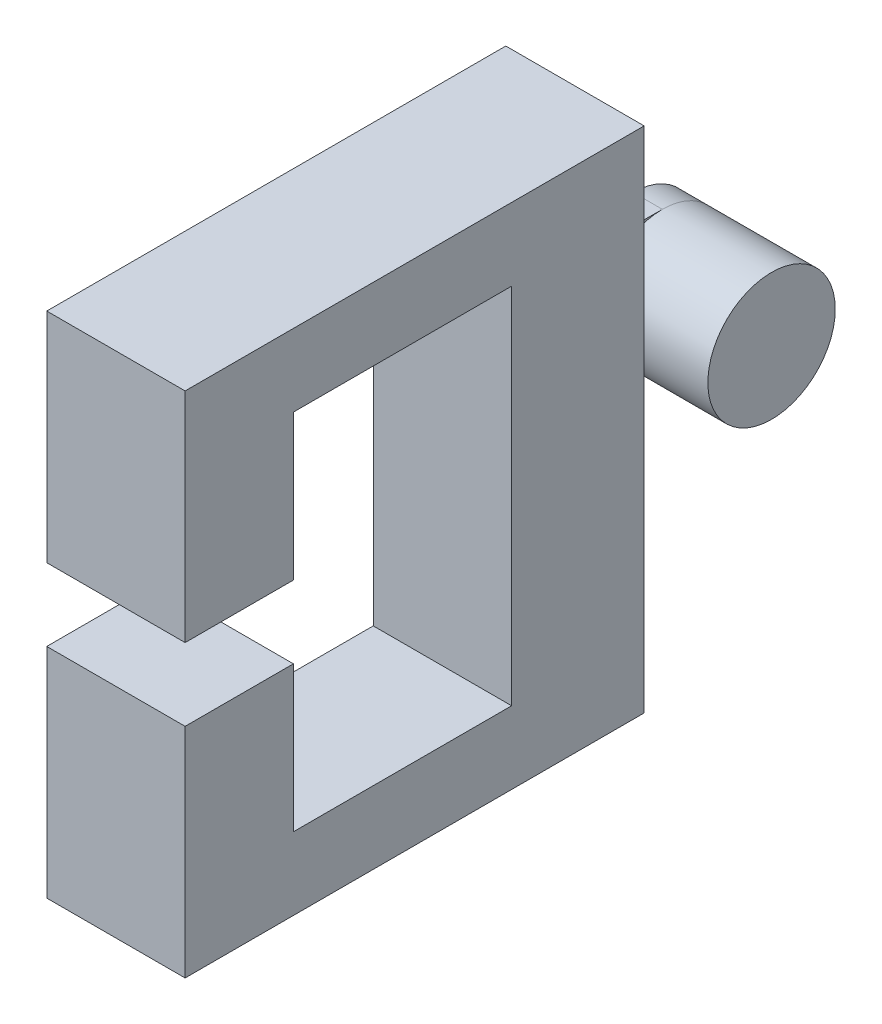
ISO-10303-21;
HEADER;
FILE_DESCRIPTION(('STEP AP214'),'2;1');
FILE_NAME('part.step','',(''),(''),'','','');
FILE_SCHEMA(('AUTOMOTIVE_DESIGN { 1 0 10303 214 1 1 1 1 }'));
ENDSEC;
DATA;
#1=APPLICATION_CONTEXT('core data for automotive mechanical design processes');
#2=APPLICATION_PROTOCOL_DEFINITION('international standard','automotive_design',2000,#1);
#3=PRODUCT_CONTEXT('',#1,'mechanical');
#4=PRODUCT('Part','Part','',(#3));
#5=PRODUCT_RELATED_PRODUCT_CATEGORY('part','',(#4));
#6=PRODUCT_DEFINITION_FORMATION('','',#4);
#7=PRODUCT_DEFINITION_CONTEXT('part definition',#1,'design');
#8=PRODUCT_DEFINITION('design','',#6,#7);
#9=PRODUCT_DEFINITION_SHAPE('','',#8);
#10=(LENGTH_UNIT() NAMED_UNIT(*) SI_UNIT(.MILLI.,.METRE.));
#11=(NAMED_UNIT(*) PLANE_ANGLE_UNIT() SI_UNIT($,.RADIAN.));
#12=(NAMED_UNIT(*) SI_UNIT($,.STERADIAN.) SOLID_ANGLE_UNIT());
#13=UNCERTAINTY_MEASURE_WITH_UNIT(LENGTH_MEASURE(1.E-05),#10,'distance_accuracy_value','');
#14=(GEOMETRIC_REPRESENTATION_CONTEXT(3) GLOBAL_UNCERTAINTY_ASSIGNED_CONTEXT((#13)) GLOBAL_UNIT_ASSIGNED_CONTEXT((#10,
#11,#12)) REPRESENTATION_CONTEXT('',''));
#15=CARTESIAN_POINT('',(0.,0.,0.));
#16=DIRECTION('',(0.,0.,1.));
#17=DIRECTION('',(1.,0.,0.));
#18=AXIS2_PLACEMENT_3D('',#15,#16,#17);
#19=CARTESIAN_POINT('',(-14.616684,0.,-22.225508));
#20=DIRECTION('',(-1.,0.,0.));
#21=DIRECTION('',(0.,0.,1.));
#22=AXIS2_PLACEMENT_3D('',#19,#20,#21);
#23=CYLINDRICAL_SURFACE('',#22,11.112754);
#24=DIRECTION('',(1.,0.,0.));
#25=VECTOR('',#24,1.);
#26=CARTESIAN_POINT('',(-14.616684,0.,-33.338262));
#27=LINE('',#26,#25);
#28=CARTESIAN_POINT('',(-14.616684,0.,-33.338262));
#29=VERTEX_POINT('',#28);
#30=CARTESIAN_POINT('',(-9.525,0.,-33.338262));
#31=VERTEX_POINT('',#30);
#32=EDGE_CURVE('E333',#29,#31,#27,.T.);
#33=ORIENTED_EDGE('',*,*,#32,.T.);
#34=CARTESIAN_POINT('',(-9.525,0.,-22.225508));
#35=DIRECTION('',(1.,0.,0.));
#36=DIRECTION('',(0.,0.,-1.));
#37=AXIS2_PLACEMENT_3D('',#34,#35,#36);
#38=CIRCLE('',#37,11.112754);
#39=CARTESIAN_POINT('',(-9.525,-11.112754,-22.225508));
#40=VERTEX_POINT('',#39);
#41=EDGE_CURVE('E330',#40,#31,#38,.T.);
#42=ORIENTED_EDGE('',*,*,#41,.F.);
#43=DIRECTION('',(-1.,0.,0.));
#44=VECTOR('',#43,1.);
#45=CARTESIAN_POINT('',(-14.616684,-11.112754,-22.225508));
#46=LINE('',#45,#44);
#47=CARTESIAN_POINT('',(-14.616684,-11.112754,-22.225508));
#48=VERTEX_POINT('',#47);
#49=EDGE_CURVE('E52',#48,#40,#46,.F.);
#50=ORIENTED_EDGE('',*,*,#49,.F.);
#51=CARTESIAN_POINT('',(-14.616684,0.,-22.225508));
#52=DIRECTION('',(1.,0.,0.));
#53=DIRECTION('',(0.,0.,-1.));
#54=AXIS2_PLACEMENT_3D('',#51,#52,#53);
#55=CIRCLE('',#54,11.112754);
#56=EDGE_CURVE('E11',#29,#48,#55,.F.);
#57=ORIENTED_EDGE('',*,*,#56,.F.);
#58=EDGE_LOOP('',(#33,#42,#50,#57));
#59=FACE_BOUND('',#58,.T.);
#60=ADVANCED_FACE('F44',(#59),#23,.T.);
#61=CARTESIAN_POINT('',(-14.616684,0.,-22.225508));
#62=DIRECTION('',(-1.,0.,0.));
#63=DIRECTION('',(0.,0.,1.));
#64=AXIS2_PLACEMENT_3D('',#61,#62,#63);
#65=CYLINDRICAL_SURFACE('',#64,11.112754);
#66=ORIENTED_EDGE('',*,*,#32,.F.);
#67=CARTESIAN_POINT('',(-14.616684,0.,-22.225508));
#68=DIRECTION('',(1.,0.,0.));
#69=DIRECTION('',(0.,0.,-1.));
#70=AXIS2_PLACEMENT_3D('',#67,#68,#69);
#71=CIRCLE('',#70,11.112754);
#72=CARTESIAN_POINT('',(-14.616684,11.112754,-22.225508));
#73=VERTEX_POINT('',#72);
#74=EDGE_CURVE('E65',#73,#29,#71,.F.);
#75=ORIENTED_EDGE('',*,*,#74,.F.);
#76=DIRECTION('',(1.,0.,0.));
#77=VECTOR('',#76,1.);
#78=CARTESIAN_POINT('',(-14.616684,11.112754,-22.225508));
#79=LINE('',#78,#77);
#80=CARTESIAN_POINT('',(-9.525,11.112754,-22.225508));
#81=VERTEX_POINT('',#80);
#82=EDGE_CURVE('E341',#81,#73,#79,.F.);
#83=ORIENTED_EDGE('',*,*,#82,.F.);
#84=EDGE_CURVE('E336',#31,#81,#38,.T.);
#85=ORIENTED_EDGE('',*,*,#84,.F.);
#86=EDGE_LOOP('',(#66,#75,#83,#85));
#87=FACE_BOUND('',#86,.T.);
#88=ADVANCED_FACE('F415',(#87),#65,.T.);
#89=CARTESIAN_POINT('',(9.525,0.,-22.225508));
#90=DIRECTION('',(-1.,0.,0.));
#91=DIRECTION('',(0.,0.,1.));
#92=AXIS2_PLACEMENT_3D('',#89,#90,#91);
#93=CYLINDRICAL_SURFACE('',#92,11.112754);
#94=CARTESIAN_POINT('',(9.525,0.,-22.225508));
#95=DIRECTION('',(1.,0.,0.));
#96=DIRECTION('',(0.,0.,-1.));
#97=AXIS2_PLACEMENT_3D('',#94,#95,#96);
#98=CIRCLE('',#97,11.112754);
#99=CARTESIAN_POINT('',(9.525,0.,-33.338262));
#100=VERTEX_POINT('',#99);
#101=EDGE_CURVE('E332',#100,#100,#98,.T.);
#102=ORIENTED_EDGE('',*,*,#101,.F.);
#103=EDGE_LOOP('',(#102));
#104=FACE_BOUND('',#103,.T.);
#105=ORIENTED_EDGE('',*,*,#84,.T.);
#106=EDGE_CURVE('E340',#81,#40,#38,.T.);
#107=ORIENTED_EDGE('',*,*,#106,.T.);
#108=ORIENTED_EDGE('',*,*,#41,.T.);
#109=EDGE_LOOP('',(#105,#107,#108));
#110=FACE_BOUND('',#109,.T.);
#111=ADVANCED_FACE('F362',(#104,#110),#93,.T.);
#112=CARTESIAN_POINT('',(9.525,0.,-22.225508));
#113=DIRECTION('',(1.,0.,0.));
#114=DIRECTION('',(0.,0.,-1.));
#115=AXIS2_PLACEMENT_3D('',#112,#113,#114);
#116=PLANE('',#115);
#117=ORIENTED_EDGE('',*,*,#101,.T.);
#118=EDGE_LOOP('',(#117));
#119=FACE_BOUND('',#118,.T.);
#120=ADVANCED_FACE('F416',(#119),#116,.T.);
#121=CARTESIAN_POINT('',(-9.525,0.,0.));
#122=DIRECTION('',(1.,0.,0.));
#123=DIRECTION('',(0.,0.,-1.));
#124=AXIS2_PLACEMENT_3D('',#121,#122,#123);
#125=PLANE('',#124);
#126=DIRECTION('',(0.,1.,0.));
#127=VECTOR('',#126,1.);
#128=CARTESIAN_POINT('',(-9.525,-44.35348,0.));
#129=LINE('',#128,#127);
#130=CARTESIAN_POINT('',(-9.525,-11.112754,0.));
#131=VERTEX_POINT('',#130);
#132=CARTESIAN_POINT('',(-9.525,11.112754,0.));
#133=VERTEX_POINT('',#132);
#134=EDGE_CURVE('E199',#131,#133,#129,.T.);
#135=ORIENTED_EDGE('',*,*,#134,.F.);
#136=DIRECTION('',(0.,0.,-1.));
#137=VECTOR('',#136,1.);
#138=CARTESIAN_POINT('',(-9.525,-11.112754,0.));
#139=LINE('',#138,#137);
#140=EDGE_CURVE('E308',#131,#40,#139,.T.);
#141=ORIENTED_EDGE('',*,*,#140,.T.);
#142=ORIENTED_EDGE('',*,*,#106,.F.);
#143=DIRECTION('',(0.,0.,-1.));
#144=VECTOR('',#143,1.);
#145=CARTESIAN_POINT('',(-9.525,11.112754,0.));
#146=LINE('',#145,#144);
#147=EDGE_CURVE('E315',#133,#81,#146,.T.);
#148=ORIENTED_EDGE('',*,*,#147,.F.);
#149=EDGE_LOOP('',(#135,#141,#142,#148));
#150=FACE_BOUND('',#149,.T.);
#151=ADVANCED_FACE('F357',(#150),#125,.T.);
#152=CARTESIAN_POINT('',(-14.616684,11.112754,0.));
#153=DIRECTION('',(0.,-1.,0.));
#154=DIRECTION('',(0.,0.,-1.));
#155=AXIS2_PLACEMENT_3D('',#152,#153,#154);
#156=PLANE('',#155);
#157=ORIENTED_EDGE('',*,*,#147,.T.);
#158=ORIENTED_EDGE('',*,*,#82,.T.);
#159=DIRECTION('',(0.,0.,-1.));
#160=VECTOR('',#159,1.);
#161=CARTESIAN_POINT('',(-14.616684,11.112754,0.));
#162=LINE('',#161,#160);
#163=CARTESIAN_POINT('',(-14.616684,11.112754,0.));
#164=VERTEX_POINT('',#163);
#165=EDGE_CURVE('E313',#164,#73,#162,.T.);
#166=ORIENTED_EDGE('',*,*,#165,.F.);
#167=DIRECTION('',(1.,0.,0.));
#168=VECTOR('',#167,1.);
#169=CARTESIAN_POINT('',(-14.616684,11.112754,0.));
#170=LINE('',#169,#168);
#171=EDGE_CURVE('E323',#164,#133,#170,.T.);
#172=ORIENTED_EDGE('',*,*,#171,.T.);
#173=EDGE_LOOP('',(#157,#158,#166,#172));
#174=FACE_BOUND('',#173,.T.);
#175=ADVANCED_FACE('F413',(#174),#156,.F.);
#176=CARTESIAN_POINT('',(-14.616684,-11.112754,0.));
#177=DIRECTION('',(0.,-1.,0.));
#178=DIRECTION('',(0.,0.,-1.));
#179=AXIS2_PLACEMENT_3D('',#176,#177,#178);
#180=PLANE('',#179);
#181=DIRECTION('',(0.,0.,-1.));
#182=VECTOR('',#181,1.);
#183=CARTESIAN_POINT('',(-14.616684,-11.112754,0.));
#184=LINE('',#183,#182);
#185=CARTESIAN_POINT('',(-14.616684,-11.112754,0.));
#186=VERTEX_POINT('',#185);
#187=EDGE_CURVE('E307',#186,#48,#184,.T.);
#188=ORIENTED_EDGE('',*,*,#187,.T.);
#189=ORIENTED_EDGE('',*,*,#49,.T.);
#190=ORIENTED_EDGE('',*,*,#140,.F.);
#191=DIRECTION('',(1.,0.,0.));
#192=VECTOR('',#191,1.);
#193=CARTESIAN_POINT('',(-14.616684,-11.112754,0.));
#194=LINE('',#193,#192);
#195=EDGE_CURVE('E316',#186,#131,#194,.T.);
#196=ORIENTED_EDGE('',*,*,#195,.F.);
#197=EDGE_LOOP('',(#188,#189,#190,#196));
#198=FACE_BOUND('',#197,.T.);
#199=ADVANCED_FACE('F351',(#198),#180,.T.);
#200=CARTESIAN_POINT('',(-14.616684,0.,0.));
#201=DIRECTION('',(1.,0.,0.));
#202=DIRECTION('',(0.,0.,-1.));
#203=AXIS2_PLACEMENT_3D('',#200,#201,#202);
#204=PLANE('',#203);
#205=ORIENTED_EDGE('',*,*,#74,.T.);
#206=ORIENTED_EDGE('',*,*,#56,.T.);
#207=ORIENTED_EDGE('',*,*,#187,.F.);
#208=DIRECTION('',(0.,-1.,0.));
#209=VECTOR('',#208,1.);
#210=CARTESIAN_POINT('',(-14.616684,-44.35348,0.));
#211=LINE('',#210,#209);
#212=CARTESIAN_POINT('',(-14.616684,-44.35348,0.));
#213=VERTEX_POINT('',#212);
#214=EDGE_CURVE('E263',#186,#213,#211,.T.);
#215=ORIENTED_EDGE('',*,*,#214,.T.);
#216=DIRECTION('',(0.,0.,1.));
#217=VECTOR('',#216,1.);
#218=CARTESIAN_POINT('',(-14.616684,-44.35348,80.091534));
#219=LINE('',#218,#217);
#220=CARTESIAN_POINT('',(-14.616684,-44.35348,80.091534));
#221=VERTEX_POINT('',#220);
#222=EDGE_CURVE('E266',#213,#221,#219,.T.);
#223=ORIENTED_EDGE('',*,*,#222,.T.);
#224=DIRECTION('',(0.,1.,0.));
#225=VECTOR('',#224,1.);
#226=CARTESIAN_POINT('',(-14.616684,-44.35348,80.091534));
#227=LINE('',#226,#225);
#228=CARTESIAN_POINT('',(-14.616684,-6.3246,80.091534));
#229=VERTEX_POINT('',#228);
#230=EDGE_CURVE('E267',#221,#229,#227,.T.);
#231=ORIENTED_EDGE('',*,*,#230,.T.);
#232=DIRECTION('',(0.,0.,-1.));
#233=VECTOR('',#232,1.);
#234=CARTESIAN_POINT('',(-14.616684,-6.3246,80.091534));
#235=LINE('',#234,#233);
#236=CARTESIAN_POINT('',(-14.616684,-6.3246,61.199776));
#237=VERTEX_POINT('',#236);
#238=EDGE_CURVE('E275',#229,#237,#235,.T.);
#239=ORIENTED_EDGE('',*,*,#238,.T.);
#240=DIRECTION('',(0.,-1.,0.));
#241=VECTOR('',#240,1.);
#242=CARTESIAN_POINT('',(-14.616684,-31.70428,61.199776));
#243=LINE('',#242,#241);
#244=CARTESIAN_POINT('',(-14.616684,-31.70428,61.199776));
#245=VERTEX_POINT('',#244);
#246=EDGE_CURVE('E202',#237,#245,#243,.T.);
#247=ORIENTED_EDGE('',*,*,#246,.T.);
#248=DIRECTION('',(0.,0.,-1.));
#249=VECTOR('',#248,1.);
#250=CARTESIAN_POINT('',(-14.616684,-31.70428,61.199776));
#251=LINE('',#250,#249);
#252=CARTESIAN_POINT('',(-14.616684,-31.70428,23.125176));
#253=VERTEX_POINT('',#252);
#254=EDGE_CURVE('E242',#245,#253,#251,.T.);
#255=ORIENTED_EDGE('',*,*,#254,.T.);
#256=DIRECTION('',(0.,1.,0.));
#257=VECTOR('',#256,1.);
#258=CARTESIAN_POINT('',(-14.616684,-31.70428,23.125176));
#259=LINE('',#258,#257);
#260=CARTESIAN_POINT('',(-14.616684,31.70428,23.125176));
#261=VERTEX_POINT('',#260);
#262=EDGE_CURVE('E245',#253,#261,#259,.T.);
#263=ORIENTED_EDGE('',*,*,#262,.T.);
#264=DIRECTION('',(0.,0.,1.));
#265=VECTOR('',#264,1.);
#266=CARTESIAN_POINT('',(-14.616684,31.70428,61.199776));
#267=LINE('',#266,#265);
#268=CARTESIAN_POINT('',(-14.616684,31.70428,61.199776));
#269=VERTEX_POINT('',#268);
#270=EDGE_CURVE('E246',#261,#269,#267,.T.);
#271=ORIENTED_EDGE('',*,*,#270,.T.);
#272=DIRECTION('',(0.,-1.,0.));
#273=VECTOR('',#272,1.);
#274=CARTESIAN_POINT('',(-14.616684,6.3246,61.199776));
#275=LINE('',#274,#273);
#276=CARTESIAN_POINT('',(-14.616684,6.3246,61.199776));
#277=VERTEX_POINT('',#276);
#278=EDGE_CURVE('E253',#269,#277,#275,.T.);
#279=ORIENTED_EDGE('',*,*,#278,.T.);
#280=DIRECTION('',(0.,0.,1.));
#281=VECTOR('',#280,1.);
#282=CARTESIAN_POINT('',(-14.616684,6.3246,80.091534));
#283=LINE('',#282,#281);
#284=CARTESIAN_POINT('',(-14.616684,6.3246,80.091534));
#285=VERTEX_POINT('',#284);
#286=EDGE_CURVE('E255',#277,#285,#283,.T.);
#287=ORIENTED_EDGE('',*,*,#286,.T.);
#288=DIRECTION('',(0.,1.,0.));
#289=VECTOR('',#288,1.);
#290=CARTESIAN_POINT('',(-14.616684,6.3246,80.091534));
#291=LINE('',#290,#289);
#292=CARTESIAN_POINT('',(-14.616684,44.35348,80.091534));
#293=VERTEX_POINT('',#292);
#294=EDGE_CURVE('E260',#285,#293,#291,.T.);
#295=ORIENTED_EDGE('',*,*,#294,.T.);
#296=DIRECTION('',(0.,0.,-1.));
#297=VECTOR('',#296,1.);
#298=CARTESIAN_POINT('',(-14.616684,44.35348,80.091534));
#299=LINE('',#298,#297);
#300=CARTESIAN_POINT('',(-14.616684,44.35348,0.));
#301=VERTEX_POINT('',#300);
#302=EDGE_CURVE('E257',#293,#301,#299,.T.);
#303=ORIENTED_EDGE('',*,*,#302,.T.);
#304=EDGE_CURVE('E172',#301,#164,#211,.T.);
#305=ORIENTED_EDGE('',*,*,#304,.T.);
#306=ORIENTED_EDGE('',*,*,#165,.T.);
#307=EDGE_LOOP('',(#205,#206,#207,#215,#223,#231,#239,#247,#255,#263,#271,#279,#287,#295,#303,
#305,#306));
#308=FACE_BOUND('',#307,.T.);
#309=ADVANCED_FACE('F364',(#308),#204,.F.);
#310=CARTESIAN_POINT('',(-14.616684,-44.35348,0.));
#311=DIRECTION('',(0.,0.,1.));
#312=DIRECTION('',(0.,-1.,0.));
#313=AXIS2_PLACEMENT_3D('',#310,#311,#312);
#314=PLANE('',#313);
#315=ORIENTED_EDGE('',*,*,#214,.F.);
#316=ORIENTED_EDGE('',*,*,#195,.T.);
#317=ORIENTED_EDGE('',*,*,#134,.T.);
#318=ORIENTED_EDGE('',*,*,#171,.F.);
#319=ORIENTED_EDGE('',*,*,#304,.F.);
#320=DIRECTION('',(1.,0.,0.));
#321=VECTOR('',#320,1.);
#322=CARTESIAN_POINT('',(-14.616684,44.35348,0.));
#323=LINE('',#322,#321);
#324=CARTESIAN_POINT('',(9.525,44.35348,0.));
#325=VERTEX_POINT('',#324);
#326=EDGE_CURVE('E163',#301,#325,#323,.T.);
#327=ORIENTED_EDGE('',*,*,#326,.T.);
#328=DIRECTION('',(0.,1.,0.));
#329=VECTOR('',#328,1.);
#330=CARTESIAN_POINT('',(9.525,-44.35348,0.));
#331=LINE('',#330,#329);
#332=CARTESIAN_POINT('',(9.525,-44.35348,0.));
#333=VERTEX_POINT('',#332);
#334=EDGE_CURVE('E166',#333,#325,#331,.T.);
#335=ORIENTED_EDGE('',*,*,#334,.F.);
#336=DIRECTION('',(1.,0.,0.));
#337=VECTOR('',#336,1.);
#338=CARTESIAN_POINT('',(-14.616684,-44.35348,0.));
#339=LINE('',#338,#337);
#340=EDGE_CURVE('E176',#213,#333,#339,.T.);
#341=ORIENTED_EDGE('',*,*,#340,.F.);
#342=EDGE_LOOP('',(#315,#316,#317,#318,#319,#327,#335,#341));
#343=FACE_BOUND('',#342,.T.);
#344=ADVANCED_FACE('F170',(#343),#314,.F.);
#345=CARTESIAN_POINT('',(-14.616684,-31.70428,61.199776));
#346=DIRECTION('',(0.,0.,1.));
#347=DIRECTION('',(1.,0.,0.));
#348=AXIS2_PLACEMENT_3D('',#345,#346,#347);
#349=PLANE('',#348);
#350=DIRECTION('',(1.,0.,0.));
#351=VECTOR('',#350,1.);
#352=CARTESIAN_POINT('',(-14.616684,-6.3246,61.199776));
#353=LINE('',#352,#351);
#354=CARTESIAN_POINT('',(9.525,-6.3246,61.199776));
#355=VERTEX_POINT('',#354);
#356=EDGE_CURVE('E274',#237,#355,#353,.T.);
#357=ORIENTED_EDGE('',*,*,#356,.T.);
#358=DIRECTION('',(0.,1.,0.));
#359=VECTOR('',#358,1.);
#360=CARTESIAN_POINT('',(9.525,-44.35348,61.199776));
#361=LINE('',#360,#359);
#362=CARTESIAN_POINT('',(9.525,-31.70428,61.199776));
#363=VERTEX_POINT('',#362);
#364=EDGE_CURVE('E213',#363,#355,#361,.T.);
#365=ORIENTED_EDGE('',*,*,#364,.F.);
#366=DIRECTION('',(1.,0.,0.));
#367=VECTOR('',#366,1.);
#368=CARTESIAN_POINT('',(-14.616684,-31.70428,61.199776));
#369=LINE('',#368,#367);
#370=EDGE_CURVE('E301',#245,#363,#369,.T.);
#371=ORIENTED_EDGE('',*,*,#370,.F.);
#372=ORIENTED_EDGE('',*,*,#246,.F.);
#373=EDGE_LOOP('',(#357,#365,#371,#372));
#374=FACE_BOUND('',#373,.T.);
#375=ADVANCED_FACE('F382',(#374),#349,.F.);
#376=CARTESIAN_POINT('',(-14.616684,-31.70428,61.199776));
#377=DIRECTION('',(0.,-1.,0.));
#378=DIRECTION('',(0.,0.,-1.));
#379=AXIS2_PLACEMENT_3D('',#376,#377,#378);
#380=PLANE('',#379);
#381=ORIENTED_EDGE('',*,*,#370,.T.);
#382=DIRECTION('',(0.,0.,-1.));
#383=VECTOR('',#382,1.);
#384=CARTESIAN_POINT('',(9.525,-31.70428,61.199776));
#385=LINE('',#384,#383);
#386=CARTESIAN_POINT('',(9.525,-31.70428,23.125176));
#387=VERTEX_POINT('',#386);
#388=EDGE_CURVE('E208',#363,#387,#385,.T.);
#389=ORIENTED_EDGE('',*,*,#388,.T.);
#390=DIRECTION('',(1.,0.,0.));
#391=VECTOR('',#390,1.);
#392=CARTESIAN_POINT('',(-14.616684,-31.70428,23.125176));
#393=LINE('',#392,#391);
#394=EDGE_CURVE('E300',#253,#387,#393,.T.);
#395=ORIENTED_EDGE('',*,*,#394,.F.);
#396=ORIENTED_EDGE('',*,*,#254,.F.);
#397=EDGE_LOOP('',(#381,#389,#395,#396));
#398=FACE_BOUND('',#397,.T.);
#399=ADVANCED_FACE('F387',(#398),#380,.F.);
#400=CARTESIAN_POINT('',(-14.616684,-31.70428,23.125176));
#401=DIRECTION('',(0.,0.,-1.));
#402=DIRECTION('',(0.,1.,0.));
#403=AXIS2_PLACEMENT_3D('',#400,#401,#402);
#404=PLANE('',#403);
#405=ORIENTED_EDGE('',*,*,#394,.T.);
#406=DIRECTION('',(0.,1.,0.));
#407=VECTOR('',#406,1.);
#408=CARTESIAN_POINT('',(9.525,-44.35348,23.125176));
#409=LINE('',#408,#407);
#410=CARTESIAN_POINT('',(9.525,31.70428,23.125176));
#411=VERTEX_POINT('',#410);
#412=EDGE_CURVE('E198',#387,#411,#409,.T.);
#413=ORIENTED_EDGE('',*,*,#412,.T.);
#414=DIRECTION('',(1.,0.,0.));
#415=VECTOR('',#414,1.);
#416=CARTESIAN_POINT('',(-14.616684,31.70428,23.125176));
#417=LINE('',#416,#415);
#418=EDGE_CURVE('E297',#261,#411,#417,.T.);
#419=ORIENTED_EDGE('',*,*,#418,.F.);
#420=ORIENTED_EDGE('',*,*,#262,.F.);
#421=EDGE_LOOP('',(#405,#413,#419,#420));
#422=FACE_BOUND('',#421,.T.);
#423=ADVANCED_FACE('F394',(#422),#404,.F.);
#424=CARTESIAN_POINT('',(-14.616684,31.70428,61.199776));
#425=DIRECTION('',(0.,1.,0.));
#426=DIRECTION('',(0.,0.,1.));
#427=AXIS2_PLACEMENT_3D('',#424,#425,#426);
#428=PLANE('',#427);
#429=ORIENTED_EDGE('',*,*,#418,.T.);
#430=DIRECTION('',(0.,0.,-1.));
#431=VECTOR('',#430,1.);
#432=CARTESIAN_POINT('',(9.525,31.70428,61.199776));
#433=LINE('',#432,#431);
#434=CARTESIAN_POINT('',(9.525,31.70428,61.199776));
#435=VERTEX_POINT('',#434);
#436=EDGE_CURVE('E230',#435,#411,#433,.T.);
#437=ORIENTED_EDGE('',*,*,#436,.F.);
#438=DIRECTION('',(1.,0.,0.));
#439=VECTOR('',#438,1.);
#440=CARTESIAN_POINT('',(-14.616684,31.70428,61.199776));
#441=LINE('',#440,#439);
#442=EDGE_CURVE('E294',#269,#435,#441,.T.);
#443=ORIENTED_EDGE('',*,*,#442,.F.);
#444=ORIENTED_EDGE('',*,*,#270,.F.);
#445=EDGE_LOOP('',(#429,#437,#443,#444));
#446=FACE_BOUND('',#445,.T.);
#447=ADVANCED_FACE('F398',(#446),#428,.F.);
#448=CARTESIAN_POINT('',(-14.616684,6.3246,61.199776));
#449=DIRECTION('',(0.,0.,1.));
#450=DIRECTION('',(1.,0.,0.));
#451=AXIS2_PLACEMENT_3D('',#448,#449,#450);
#452=PLANE('',#451);
#453=ORIENTED_EDGE('',*,*,#442,.T.);
#454=DIRECTION('',(0.,1.,0.));
#455=VECTOR('',#454,1.);
#456=CARTESIAN_POINT('',(9.525,6.3246,61.199776));
#457=LINE('',#456,#455);
#458=CARTESIAN_POINT('',(9.525,6.3246,61.199776));
#459=VERTEX_POINT('',#458);
#460=EDGE_CURVE('E223',#459,#435,#457,.T.);
#461=ORIENTED_EDGE('',*,*,#460,.F.);
#462=DIRECTION('',(1.,0.,0.));
#463=VECTOR('',#462,1.);
#464=CARTESIAN_POINT('',(-14.616684,6.3246,61.199776));
#465=LINE('',#464,#463);
#466=EDGE_CURVE('E292',#277,#459,#465,.T.);
#467=ORIENTED_EDGE('',*,*,#466,.F.);
#468=ORIENTED_EDGE('',*,*,#278,.F.);
#469=EDGE_LOOP('',(#453,#461,#467,#468));
#470=FACE_BOUND('',#469,.T.);
#471=ADVANCED_FACE('F402',(#470),#452,.F.);
#472=CARTESIAN_POINT('',(-14.616684,6.3246,80.091534));
#473=DIRECTION('',(0.,1.,0.));
#474=DIRECTION('',(0.,0.,1.));
#475=AXIS2_PLACEMENT_3D('',#472,#473,#474);
#476=PLANE('',#475);
#477=ORIENTED_EDGE('',*,*,#466,.T.);
#478=DIRECTION('',(0.,0.,-1.));
#479=VECTOR('',#478,1.);
#480=CARTESIAN_POINT('',(9.525,6.3246,80.091534));
#481=LINE('',#480,#479);
#482=CARTESIAN_POINT('',(9.525,6.3246,80.091534));
#483=VERTEX_POINT('',#482);
#484=EDGE_CURVE('E217',#483,#459,#481,.T.);
#485=ORIENTED_EDGE('',*,*,#484,.F.);
#486=DIRECTION('',(1.,0.,0.));
#487=VECTOR('',#486,1.);
#488=CARTESIAN_POINT('',(-14.616684,6.3246,80.091534));
#489=LINE('',#488,#487);
#490=EDGE_CURVE('E286',#285,#483,#489,.T.);
#491=ORIENTED_EDGE('',*,*,#490,.F.);
#492=ORIENTED_EDGE('',*,*,#286,.F.);
#493=EDGE_LOOP('',(#477,#485,#491,#492));
#494=FACE_BOUND('',#493,.T.);
#495=ADVANCED_FACE('F407',(#494),#476,.F.);
#496=CARTESIAN_POINT('',(-14.616684,6.3246,80.091534));
#497=DIRECTION('',(0.,0.,-1.));
#498=DIRECTION('',(-1.,0.,0.));
#499=AXIS2_PLACEMENT_3D('',#496,#497,#498);
#500=PLANE('',#499);
#501=ORIENTED_EDGE('',*,*,#490,.T.);
#502=DIRECTION('',(0.,1.,0.));
#503=VECTOR('',#502,1.);
#504=CARTESIAN_POINT('',(9.525,6.3246,80.091534));
#505=LINE('',#504,#503);
#506=CARTESIAN_POINT('',(9.525,44.35348,80.091534));
#507=VERTEX_POINT('',#506);
#508=EDGE_CURVE('E228',#483,#507,#505,.T.);
#509=ORIENTED_EDGE('',*,*,#508,.T.);
#510=DIRECTION('',(1.,0.,0.));
#511=VECTOR('',#510,1.);
#512=CARTESIAN_POINT('',(-14.616684,44.35348,80.091534));
#513=LINE('',#512,#511);
#514=EDGE_CURVE('E180',#293,#507,#513,.T.);
#515=ORIENTED_EDGE('',*,*,#514,.F.);
#516=ORIENTED_EDGE('',*,*,#294,.F.);
#517=EDGE_LOOP('',(#501,#509,#515,#516));
#518=FACE_BOUND('',#517,.T.);
#519=ADVANCED_FACE('F408',(#518),#500,.F.);
#520=CARTESIAN_POINT('',(-14.616684,44.35348,80.091534));
#521=DIRECTION('',(0.,-1.,0.));
#522=DIRECTION('',(0.,0.,-1.));
#523=AXIS2_PLACEMENT_3D('',#520,#521,#522);
#524=PLANE('',#523);
#525=ORIENTED_EDGE('',*,*,#514,.T.);
#526=DIRECTION('',(0.,0.,-1.));
#527=VECTOR('',#526,1.);
#528=CARTESIAN_POINT('',(9.525,44.35348,23.125176));
#529=LINE('',#528,#527);
#530=EDGE_CURVE('E186',#507,#325,#529,.T.);
#531=ORIENTED_EDGE('',*,*,#530,.T.);
#532=ORIENTED_EDGE('',*,*,#326,.F.);
#533=ORIENTED_EDGE('',*,*,#302,.F.);
#534=EDGE_LOOP('',(#525,#531,#532,#533));
#535=FACE_BOUND('',#534,.T.);
#536=ADVANCED_FACE('F191',(#535),#524,.F.);
#537=CARTESIAN_POINT('',(-14.616684,-44.35348,80.091534));
#538=DIRECTION('',(0.,1.,0.));
#539=DIRECTION('',(0.,0.,1.));
#540=AXIS2_PLACEMENT_3D('',#537,#538,#539);
#541=PLANE('',#540);
#542=ORIENTED_EDGE('',*,*,#340,.T.);
#543=DIRECTION('',(0.,0.,-1.));
#544=VECTOR('',#543,1.);
#545=CARTESIAN_POINT('',(9.525,-44.35348,23.125176));
#546=LINE('',#545,#544);
#547=CARTESIAN_POINT('',(9.525,-44.35348,80.091534));
#548=VERTEX_POINT('',#547);
#549=EDGE_CURVE('E190',#548,#333,#546,.T.);
#550=ORIENTED_EDGE('',*,*,#549,.F.);
#551=DIRECTION('',(1.,0.,0.));
#552=VECTOR('',#551,1.);
#553=CARTESIAN_POINT('',(-14.616684,-44.35348,80.091534));
#554=LINE('',#553,#552);
#555=EDGE_CURVE('E281',#221,#548,#554,.T.);
#556=ORIENTED_EDGE('',*,*,#555,.F.);
#557=ORIENTED_EDGE('',*,*,#222,.F.);
#558=EDGE_LOOP('',(#542,#550,#556,#557));
#559=FACE_BOUND('',#558,.T.);
#560=ADVANCED_FACE('F369',(#559),#541,.F.);
#561=CARTESIAN_POINT('',(-14.616684,-44.35348,80.091534));
#562=DIRECTION('',(0.,0.,-1.));
#563=DIRECTION('',(-1.,0.,0.));
#564=AXIS2_PLACEMENT_3D('',#561,#562,#563);
#565=PLANE('',#564);
#566=ORIENTED_EDGE('',*,*,#555,.T.);
#567=DIRECTION('',(0.,1.,0.));
#568=VECTOR('',#567,1.);
#569=CARTESIAN_POINT('',(9.525,-44.35348,80.091534));
#570=LINE('',#569,#568);
#571=CARTESIAN_POINT('',(9.525,-6.3246,80.091534));
#572=VERTEX_POINT('',#571);
#573=EDGE_CURVE('E215',#548,#572,#570,.T.);
#574=ORIENTED_EDGE('',*,*,#573,.T.);
#575=DIRECTION('',(1.,0.,0.));
#576=VECTOR('',#575,1.);
#577=CARTESIAN_POINT('',(-14.616684,-6.3246,80.091534));
#578=LINE('',#577,#576);
#579=EDGE_CURVE('E279',#229,#572,#578,.T.);
#580=ORIENTED_EDGE('',*,*,#579,.F.);
#581=ORIENTED_EDGE('',*,*,#230,.F.);
#582=EDGE_LOOP('',(#566,#574,#580,#581));
#583=FACE_BOUND('',#582,.T.);
#584=ADVANCED_FACE('F373',(#583),#565,.F.);
#585=CARTESIAN_POINT('',(-14.616684,-6.3246,80.091534));
#586=DIRECTION('',(0.,-1.,0.));
#587=DIRECTION('',(0.,0.,-1.));
#588=AXIS2_PLACEMENT_3D('',#585,#586,#587);
#589=PLANE('',#588);
#590=ORIENTED_EDGE('',*,*,#579,.T.);
#591=DIRECTION('',(0.,0.,-1.));
#592=VECTOR('',#591,1.);
#593=CARTESIAN_POINT('',(9.525,-6.3246,80.091534));
#594=LINE('',#593,#592);
#595=EDGE_CURVE('E220',#572,#355,#594,.T.);
#596=ORIENTED_EDGE('',*,*,#595,.T.);
#597=ORIENTED_EDGE('',*,*,#356,.F.);
#598=ORIENTED_EDGE('',*,*,#238,.F.);
#599=EDGE_LOOP('',(#590,#596,#597,#598));
#600=FACE_BOUND('',#599,.T.);
#601=ADVANCED_FACE('F377',(#600),#589,.F.);
#602=CARTESIAN_POINT('',(9.525,0.,0.));
#603=DIRECTION('',(-1.,0.,0.));
#604=DIRECTION('',(0.,0.,1.));
#605=AXIS2_PLACEMENT_3D('',#602,#603,#604);
#606=PLANE('',#605);
#607=ORIENTED_EDGE('',*,*,#412,.F.);
#608=ORIENTED_EDGE('',*,*,#388,.F.);
#609=ORIENTED_EDGE('',*,*,#364,.T.);
#610=ORIENTED_EDGE('',*,*,#595,.F.);
#611=ORIENTED_EDGE('',*,*,#573,.F.);
#612=ORIENTED_EDGE('',*,*,#549,.T.);
#613=ORIENTED_EDGE('',*,*,#334,.T.);
#614=ORIENTED_EDGE('',*,*,#530,.F.);
#615=ORIENTED_EDGE('',*,*,#508,.F.);
#616=ORIENTED_EDGE('',*,*,#484,.T.);
#617=ORIENTED_EDGE('',*,*,#460,.T.);
#618=ORIENTED_EDGE('',*,*,#436,.T.);
#619=EDGE_LOOP('',(#607,#608,#609,#610,#611,#612,#613,#614,#615,#616,#617,#618));
#620=FACE_BOUND('',#619,.T.);
#621=ADVANCED_FACE('F184',(#620),#606,.F.);
#622=CLOSED_SHELL('',(#60,#88,#111,#120,#151,#175,#199,#309,#344,#375,#399,#423,#447,#471,#495,
#519,#536,#560,#584,#601,#621));
#623=MANIFOLD_SOLID_BREP('B2',#622);
#624=ADVANCED_BREP_SHAPE_REPRESENTATION('',(#18,#623),#14);
#625=SHAPE_DEFINITION_REPRESENTATION(#9,#624);
ENDSEC;
END-ISO-10303-21;
